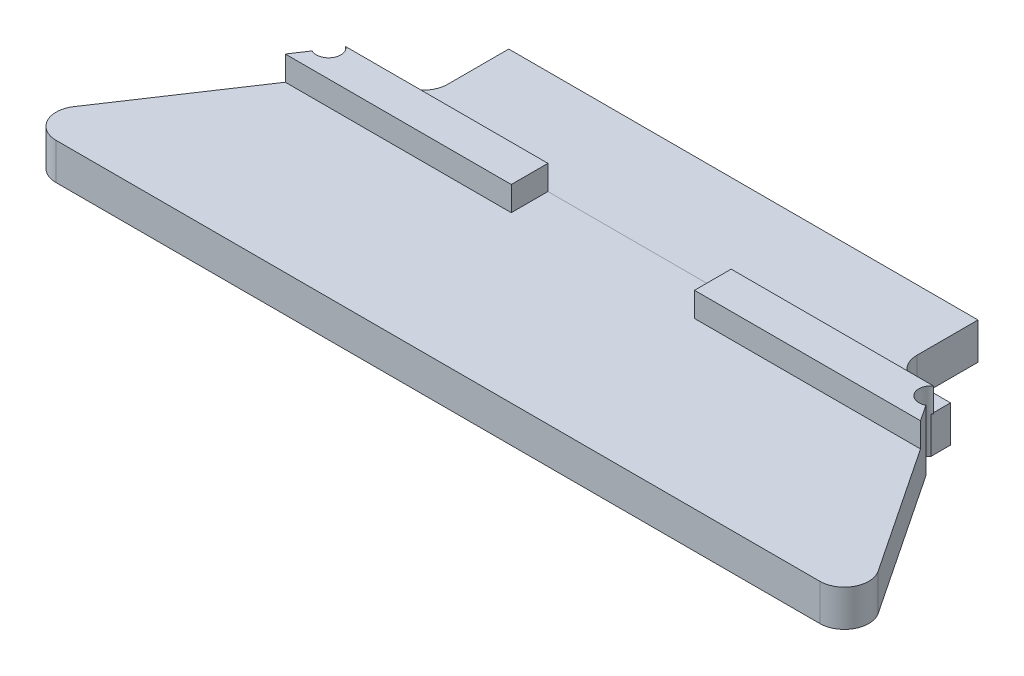
ISO-10303-21;
HEADER;
FILE_DESCRIPTION(('STEP AP214'),'2;1');
FILE_NAME('part.step','',(''),(''),'','','');
FILE_SCHEMA(('AUTOMOTIVE_DESIGN { 1 0 10303 214 1 1 1 1 }'));
ENDSEC;
DATA;
#1=APPLICATION_CONTEXT('core data for automotive mechanical design processes');
#2=APPLICATION_PROTOCOL_DEFINITION('international standard','automotive_design',2000,#1);
#3=PRODUCT_CONTEXT('',#1,'mechanical');
#4=PRODUCT('Part','Part','',(#3));
#5=PRODUCT_RELATED_PRODUCT_CATEGORY('part','',(#4));
#6=PRODUCT_DEFINITION_FORMATION('','',#4);
#7=PRODUCT_DEFINITION_CONTEXT('part definition',#1,'design');
#8=PRODUCT_DEFINITION('design','',#6,#7);
#9=PRODUCT_DEFINITION_SHAPE('','',#8);
#10=(LENGTH_UNIT() NAMED_UNIT(*) SI_UNIT(.MILLI.,.METRE.));
#11=(NAMED_UNIT(*) PLANE_ANGLE_UNIT() SI_UNIT($,.RADIAN.));
#12=(NAMED_UNIT(*) SI_UNIT($,.STERADIAN.) SOLID_ANGLE_UNIT());
#13=UNCERTAINTY_MEASURE_WITH_UNIT(LENGTH_MEASURE(1.E-05),#10,'distance_accuracy_value','');
#14=(GEOMETRIC_REPRESENTATION_CONTEXT(3) GLOBAL_UNCERTAINTY_ASSIGNED_CONTEXT((#13)) GLOBAL_UNIT_ASSIGNED_CONTEXT((#10,
#11,#12)) REPRESENTATION_CONTEXT('',''));
#15=CARTESIAN_POINT('',(0.,0.,0.));
#16=DIRECTION('',(0.,0.,1.));
#17=DIRECTION('',(1.,0.,0.));
#18=AXIS2_PLACEMENT_3D('',#15,#16,#17);
#19=CARTESIAN_POINT('',(0.,-1.5,0.));
#20=DIRECTION('',(0.,1.,0.));
#21=DIRECTION('',(0.,0.,1.));
#22=AXIS2_PLACEMENT_3D('',#19,#20,#21);
#23=PLANE('',#22);
#24=DIRECTION('',(-1.,0.,0.));
#25=VECTOR('',#24,1.);
#26=CARTESIAN_POINT('',(0.,-1.5,-4.00000000000001));
#27=LINE('',#26,#25);
#28=CARTESIAN_POINT('',(23.95625,-1.5,-4.00000000000001));
#29=VERTEX_POINT('',#28);
#30=CARTESIAN_POINT('',(7.50000000000001,-1.5,-4.00000000000001));
#31=VERTEX_POINT('',#30);
#32=EDGE_CURVE('E11',#29,#31,#27,.T.);
#33=ORIENTED_EDGE('',*,*,#32,.F.);
#34=DIRECTION('',(0.,0.,1.));
#35=VECTOR('',#34,1.);
#36=CARTESIAN_POINT('',(23.95625,-1.5,-5.50000000000001));
#37=LINE('',#36,#35);
#38=CARTESIAN_POINT('',(23.95625,-1.5,-3.91421356237311));
#39=VERTEX_POINT('',#38);
#40=EDGE_CURVE('E299',#29,#39,#37,.T.);
#41=ORIENTED_EDGE('',*,*,#40,.T.);
#42=CARTESIAN_POINT('',(24.6633567811865,-1.5,-3.20710678118655));
#43=DIRECTION('',(0.,1.,0.));
#44=DIRECTION('',(0.,0.,-1.));
#45=AXIS2_PLACEMENT_3D('',#42,#43,#44);
#46=CIRCLE('',#45,1.);
#47=CARTESIAN_POINT('',(25.1212626139406,-1.5,-2.31810607908908));
#48=VERTEX_POINT('',#47);
#49=EDGE_CURVE('E288',#39,#48,#46,.T.);
#50=ORIENTED_EDGE('',*,*,#49,.T.);
#51=DIRECTION('',(-0.554700196225229,0.,-0.832050294337843));
#52=VECTOR('',#51,1.);
#53=CARTESIAN_POINT('',(25.,-1.5,-2.5));
#54=LINE('',#53,#52);
#55=CARTESIAN_POINT('',(32.927066405033,-1.5,9.39059960754954));
#56=VERTEX_POINT('',#55);
#57=EDGE_CURVE('E344',#56,#48,#54,.T.);
#58=ORIENTED_EDGE('',*,*,#57,.F.);
#59=CARTESIAN_POINT('',(31.2629658163574,-1.5,10.5));
#60=DIRECTION('',(0.,1.,0.));
#61=DIRECTION('',(0.,0.,1.));
#62=AXIS2_PLACEMENT_3D('',#59,#60,#61);
#63=CIRCLE('',#62,2.);
#64=CARTESIAN_POINT('',(31.2629658163574,-1.5,12.5));
#65=VERTEX_POINT('',#64);
#66=EDGE_CURVE('E381',#56,#65,#63,.F.);
#67=ORIENTED_EDGE('',*,*,#66,.T.);
#68=DIRECTION('',(1.,0.,0.));
#69=VECTOR('',#68,1.);
#70=CARTESIAN_POINT('',(35.,-1.5,12.5));
#71=LINE('',#70,#69);
#72=CARTESIAN_POINT('',(-31.2629658163573,-1.5,12.5));
#73=VERTEX_POINT('',#72);
#74=EDGE_CURVE('E318',#73,#65,#71,.T.);
#75=ORIENTED_EDGE('',*,*,#74,.F.);
#76=CARTESIAN_POINT('',(-31.2629658163573,-1.5,10.5));
#77=DIRECTION('',(0.,1.,0.));
#78=DIRECTION('',(0.,0.,1.));
#79=AXIS2_PLACEMENT_3D('',#76,#77,#78);
#80=CIRCLE('',#79,2.);
#81=CARTESIAN_POINT('',(-32.927066405033,-1.5,9.39059960754954));
#82=VERTEX_POINT('',#81);
#83=EDGE_CURVE('E379',#73,#82,#80,.F.);
#84=ORIENTED_EDGE('',*,*,#83,.T.);
#85=DIRECTION('',(-0.554700196225229,0.,0.832050294337844));
#86=VECTOR('',#85,1.);
#87=CARTESIAN_POINT('',(-25.,-1.5,-2.49999999999999));
#88=LINE('',#87,#86);
#89=CARTESIAN_POINT('',(-25.1212626139406,-1.5,-2.31810607908908));
#90=VERTEX_POINT('',#89);
#91=EDGE_CURVE('E323',#90,#82,#88,.T.);
#92=ORIENTED_EDGE('',*,*,#91,.F.);
#93=CARTESIAN_POINT('',(-24.6633567811865,-1.5,-3.20710678118655));
#94=DIRECTION('',(0.,1.,0.));
#95=DIRECTION('',(0.,0.,1.));
#96=AXIS2_PLACEMENT_3D('',#93,#94,#95);
#97=CIRCLE('',#96,1.);
#98=CARTESIAN_POINT('',(-23.95625,-1.5,-3.91421356237311));
#99=VERTEX_POINT('',#98);
#100=EDGE_CURVE('E289',#90,#99,#97,.T.);
#101=ORIENTED_EDGE('',*,*,#100,.T.);
#102=DIRECTION('',(0.,0.,-1.));
#103=VECTOR('',#102,1.);
#104=CARTESIAN_POINT('',(-23.95625,-1.5,-5.50000000000001));
#105=LINE('',#104,#103);
#106=CARTESIAN_POINT('',(-23.95625,-1.5,-4.00000000000001));
#107=VERTEX_POINT('',#106);
#108=EDGE_CURVE('E300',#99,#107,#105,.T.);
#109=ORIENTED_EDGE('',*,*,#108,.T.);
#110=DIRECTION('',(-1.,0.,0.));
#111=VECTOR('',#110,1.);
#112=CARTESIAN_POINT('',(0.,-1.5,-4.00000000000001));
#113=LINE('',#112,#111);
#114=CARTESIAN_POINT('',(-7.49999999999999,-1.5,-4.00000000000001));
#115=VERTEX_POINT('',#114);
#116=EDGE_CURVE('E411',#115,#107,#113,.T.);
#117=ORIENTED_EDGE('',*,*,#116,.F.);
#118=DIRECTION('',(-1.,0.,0.));
#119=VECTOR('',#118,1.);
#120=CARTESIAN_POINT('',(0.,-1.5,-4.00000000000001));
#121=LINE('',#120,#119);
#122=EDGE_CURVE('E51',#31,#115,#121,.T.);
#123=ORIENTED_EDGE('',*,*,#122,.F.);
#124=EDGE_LOOP('',(#33,#41,#50,#58,#67,#75,#84,#92,#101,#109,#117,#123));
#125=FACE_BOUND('',#124,.T.);
#126=ADVANCED_FACE('F42',(#125),#23,.F.);
#127=CARTESIAN_POINT('',(0.,1.5,0.));
#128=DIRECTION('',(0.,1.,0.));
#129=DIRECTION('',(0.,0.,1.));
#130=AXIS2_PLACEMENT_3D('',#127,#128,#129);
#131=PLANE('',#130);
#132=DIRECTION('',(0.,0.,1.));
#133=VECTOR('',#132,1.);
#134=CARTESIAN_POINT('',(7.50000000000001,1.5,-4.00000000000001));
#135=LINE('',#134,#133);
#136=CARTESIAN_POINT('',(7.50000000000001,1.5,-4.00000000000001));
#137=VERTEX_POINT('',#136);
#138=CARTESIAN_POINT('',(7.50000000000001,1.5,-1.00000000000001));
#139=VERTEX_POINT('',#138);
#140=EDGE_CURVE('E547',#137,#139,#135,.T.);
#141=ORIENTED_EDGE('',*,*,#140,.F.);
#142=DIRECTION('',(-1.,0.,0.));
#143=VECTOR('',#142,1.);
#144=CARTESIAN_POINT('',(0.,1.5,-4.00000000000001));
#145=LINE('',#144,#143);
#146=CARTESIAN_POINT('',(-7.49999999999999,1.5,-4.00000000000001));
#147=VERTEX_POINT('',#146);
#148=EDGE_CURVE('E408',#137,#147,#145,.T.);
#149=ORIENTED_EDGE('',*,*,#148,.T.);
#150=DIRECTION('',(0.,0.,-1.));
#151=VECTOR('',#150,1.);
#152=CARTESIAN_POINT('',(-7.49999999999999,1.5,-4.00000000000001));
#153=LINE('',#152,#151);
#154=CARTESIAN_POINT('',(-7.49999999999999,1.5,-1.00000000000001));
#155=VERTEX_POINT('',#154);
#156=EDGE_CURVE('E271',#155,#147,#153,.T.);
#157=ORIENTED_EDGE('',*,*,#156,.F.);
#158=DIRECTION('',(1.,0.,0.));
#159=VECTOR('',#158,1.);
#160=CARTESIAN_POINT('',(-7.49999999999999,1.5,-1.00000000000001));
#161=LINE('',#160,#159);
#162=CARTESIAN_POINT('',(-26.,1.5,-1.00000000000001));
#163=VERTEX_POINT('',#162);
#164=EDGE_CURVE('E268',#163,#155,#161,.T.);
#165=ORIENTED_EDGE('',*,*,#164,.F.);
#166=DIRECTION('',(-0.554700196225229,0.,0.832050294337844));
#167=VECTOR('',#166,1.);
#168=CARTESIAN_POINT('',(-25.,1.5,-2.49999999999999));
#169=LINE('',#168,#167);
#170=CARTESIAN_POINT('',(-32.927066405033,1.5,9.39059960754954));
#171=VERTEX_POINT('',#170);
#172=EDGE_CURVE('E339',#163,#171,#169,.T.);
#173=ORIENTED_EDGE('',*,*,#172,.T.);
#174=CARTESIAN_POINT('',(-31.2629658163573,1.5,10.5));
#175=DIRECTION('',(0.,1.,0.));
#176=DIRECTION('',(0.,0.,1.));
#177=AXIS2_PLACEMENT_3D('',#174,#175,#176);
#178=CIRCLE('',#177,2.);
#179=CARTESIAN_POINT('',(-31.2629658163573,1.5,12.5));
#180=VERTEX_POINT('',#179);
#181=EDGE_CURVE('E388',#171,#180,#178,.T.);
#182=ORIENTED_EDGE('',*,*,#181,.T.);
#183=DIRECTION('',(1.,0.,0.));
#184=VECTOR('',#183,1.);
#185=CARTESIAN_POINT('',(-35.,1.5,12.5));
#186=LINE('',#185,#184);
#187=CARTESIAN_POINT('',(31.2629658163574,1.5,12.5));
#188=VERTEX_POINT('',#187);
#189=EDGE_CURVE('E319',#180,#188,#186,.T.);
#190=ORIENTED_EDGE('',*,*,#189,.T.);
#191=CARTESIAN_POINT('',(31.2629658163574,1.5,10.5));
#192=DIRECTION('',(0.,1.,0.));
#193=DIRECTION('',(0.,0.,1.));
#194=AXIS2_PLACEMENT_3D('',#191,#192,#193);
#195=CIRCLE('',#194,2.);
#196=CARTESIAN_POINT('',(32.927066405033,1.5,9.39059960754954));
#197=VERTEX_POINT('',#196);
#198=EDGE_CURVE('E390',#188,#197,#195,.T.);
#199=ORIENTED_EDGE('',*,*,#198,.T.);
#200=DIRECTION('',(-0.554700196225229,0.,-0.832050294337843));
#201=VECTOR('',#200,1.);
#202=CARTESIAN_POINT('',(25.,1.5,-2.5));
#203=LINE('',#202,#201);
#204=CARTESIAN_POINT('',(26.,1.5,-1.00000000000001));
#205=VERTEX_POINT('',#204);
#206=EDGE_CURVE('E322',#197,#205,#203,.T.);
#207=ORIENTED_EDGE('',*,*,#206,.T.);
#208=DIRECTION('',(1.,0.,0.));
#209=VECTOR('',#208,1.);
#210=CARTESIAN_POINT('',(7.50000000000001,1.5,-1.00000000000001));
#211=LINE('',#210,#209);
#212=EDGE_CURVE('E238',#139,#205,#211,.T.);
#213=ORIENTED_EDGE('',*,*,#212,.F.);
#214=EDGE_LOOP('',(#141,#149,#157,#165,#173,#182,#190,#199,#207,#213));
#215=FACE_BOUND('',#214,.T.);
#216=ADVANCED_FACE('F479',(#215),#131,.T.);
#217=ORIENTED_EDGE('',*,*,#148,.F.);
#218=DIRECTION('',(-1.,0.,0.));
#219=VECTOR('',#218,1.);
#220=CARTESIAN_POINT('',(24.0539961789487,1.5,-4.00000000000001));
#221=LINE('',#220,#219);
#222=CARTESIAN_POINT('',(23.95625,1.5,-4.00000000000001));
#223=VERTEX_POINT('',#222);
#224=EDGE_CURVE('E544',#223,#137,#221,.T.);
#225=ORIENTED_EDGE('',*,*,#224,.F.);
#226=DIRECTION('',(0.,0.,1.));
#227=VECTOR('',#226,1.);
#228=CARTESIAN_POINT('',(23.95625,1.5,0.));
#229=LINE('',#228,#227);
#230=CARTESIAN_POINT('',(23.95625,1.5,-5.50000000000001));
#231=VERTEX_POINT('',#230);
#232=EDGE_CURVE('E307',#231,#223,#229,.T.);
#233=ORIENTED_EDGE('',*,*,#232,.F.);
#234=DIRECTION('',(-1.,0.,0.));
#235=VECTOR('',#234,1.);
#236=CARTESIAN_POINT('',(24.20625,1.5,-5.50000000000001));
#237=LINE('',#236,#235);
#238=CARTESIAN_POINT('',(21.20625,1.5,-5.50000000000001));
#239=VERTEX_POINT('',#238);
#240=EDGE_CURVE('E326',#231,#239,#237,.T.);
#241=ORIENTED_EDGE('',*,*,#240,.T.);
#242=CARTESIAN_POINT('',(21.20625,1.5,-7.50000000000001));
#243=DIRECTION('',(0.,1.,0.));
#244=DIRECTION('',(0.,0.,1.));
#245=AXIS2_PLACEMENT_3D('',#242,#243,#244);
#246=CIRCLE('',#245,2.);
#247=CARTESIAN_POINT('',(19.20625,1.5,-7.50000000000001));
#248=VERTEX_POINT('',#247);
#249=EDGE_CURVE('E402',#239,#248,#246,.F.);
#250=ORIENTED_EDGE('',*,*,#249,.T.);
#251=DIRECTION('',(0.,0.,-1.));
#252=VECTOR('',#251,1.);
#253=CARTESIAN_POINT('',(19.20625,1.5,-5.50000000000001));
#254=LINE('',#253,#252);
#255=CARTESIAN_POINT('',(19.20625,1.5,-12.5));
#256=VERTEX_POINT('',#255);
#257=EDGE_CURVE('E329',#248,#256,#254,.T.);
#258=ORIENTED_EDGE('',*,*,#257,.T.);
#259=DIRECTION('',(-1.,0.,0.));
#260=VECTOR('',#259,1.);
#261=CARTESIAN_POINT('',(-19.20625,1.5,-12.5));
#262=LINE('',#261,#260);
#263=CARTESIAN_POINT('',(-19.20625,1.5,-12.5));
#264=VERTEX_POINT('',#263);
#265=EDGE_CURVE('E331',#256,#264,#262,.T.);
#266=ORIENTED_EDGE('',*,*,#265,.T.);
#267=DIRECTION('',(0.,0.,1.));
#268=VECTOR('',#267,1.);
#269=CARTESIAN_POINT('',(-19.20625,1.5,-5.50000000000001));
#270=LINE('',#269,#268);
#271=CARTESIAN_POINT('',(-19.20625,1.5,-7.50000000000001));
#272=VERTEX_POINT('',#271);
#273=EDGE_CURVE('E333',#264,#272,#270,.T.);
#274=ORIENTED_EDGE('',*,*,#273,.T.);
#275=CARTESIAN_POINT('',(-21.20625,1.5,-7.50000000000001));
#276=DIRECTION('',(0.,1.,0.));
#277=DIRECTION('',(0.,0.,1.));
#278=AXIS2_PLACEMENT_3D('',#275,#276,#277);
#279=CIRCLE('',#278,2.);
#280=CARTESIAN_POINT('',(-21.20625,1.5,-5.50000000000001));
#281=VERTEX_POINT('',#280);
#282=EDGE_CURVE('E406',#272,#281,#279,.F.);
#283=ORIENTED_EDGE('',*,*,#282,.T.);
#284=DIRECTION('',(-1.,0.,0.));
#285=VECTOR('',#284,1.);
#286=CARTESIAN_POINT('',(-24.20625,1.5,-5.50000000000001));
#287=LINE('',#286,#285);
#288=CARTESIAN_POINT('',(-23.95625,1.5,-5.50000000000001));
#289=VERTEX_POINT('',#288);
#290=EDGE_CURVE('E336',#281,#289,#287,.T.);
#291=ORIENTED_EDGE('',*,*,#290,.T.);
#292=DIRECTION('',(0.,0.,-1.));
#293=VECTOR('',#292,1.);
#294=CARTESIAN_POINT('',(-23.95625,1.5,0.));
#295=LINE('',#294,#293);
#296=CARTESIAN_POINT('',(-23.95625,1.5,-4.00000000000001));
#297=VERTEX_POINT('',#296);
#298=EDGE_CURVE('E314',#297,#289,#295,.T.);
#299=ORIENTED_EDGE('',*,*,#298,.F.);
#300=DIRECTION('',(-1.,0.,0.));
#301=VECTOR('',#300,1.);
#302=CARTESIAN_POINT('',(-24.0539961789487,1.5,-4.00000000000001));
#303=LINE('',#302,#301);
#304=EDGE_CURVE('E257',#147,#297,#303,.T.);
#305=ORIENTED_EDGE('',*,*,#304,.F.);
#306=EDGE_LOOP('',(#217,#225,#233,#241,#250,#258,#266,#274,#283,#291,#299,#305));
#307=FACE_BOUND('',#306,.T.);
#308=ADVANCED_FACE('F454',(#307),#131,.T.);
#309=CARTESIAN_POINT('',(35.,1.5,12.5));
#310=DIRECTION('',(0.,0.,-1.));
#311=DIRECTION('',(-1.,0.,0.));
#312=AXIS2_PLACEMENT_3D('',#309,#310,#311);
#313=PLANE('',#312);
#314=ORIENTED_EDGE('',*,*,#74,.T.);
#315=DIRECTION('',(0.,-1.,0.));
#316=VECTOR('',#315,1.);
#317=CARTESIAN_POINT('',(31.2629658163574,1.5,12.5));
#318=LINE('',#317,#316);
#319=EDGE_CURVE('E386',#65,#188,#318,.F.);
#320=ORIENTED_EDGE('',*,*,#319,.T.);
#321=ORIENTED_EDGE('',*,*,#189,.F.);
#322=DIRECTION('',(0.,-1.,0.));
#323=VECTOR('',#322,1.);
#324=CARTESIAN_POINT('',(-31.2629658163573,1.5,12.5));
#325=LINE('',#324,#323);
#326=EDGE_CURVE('E383',#180,#73,#325,.T.);
#327=ORIENTED_EDGE('',*,*,#326,.T.);
#328=EDGE_LOOP('',(#314,#320,#321,#327));
#329=FACE_BOUND('',#328,.T.);
#330=ADVANCED_FACE('F518',(#329),#313,.F.);
#331=CARTESIAN_POINT('',(25.,1.5,-2.5));
#332=DIRECTION('',(-0.832050294337844,0.,0.554700196225229));
#333=DIRECTION('',(0.554700196225229,0.,0.832050294337844));
#334=AXIS2_PLACEMENT_3D('',#331,#332,#333);
#335=PLANE('',#334);
#336=ORIENTED_EDGE('',*,*,#206,.F.);
#337=DIRECTION('',(0.,-1.,0.));
#338=VECTOR('',#337,1.);
#339=CARTESIAN_POINT('',(32.927066405033,1.5,9.39059960754954));
#340=LINE('',#339,#338);
#341=EDGE_CURVE('E376',#197,#56,#340,.T.);
#342=ORIENTED_EDGE('',*,*,#341,.T.);
#343=ORIENTED_EDGE('',*,*,#57,.T.);
#344=DIRECTION('',(0.,1.,0.));
#345=VECTOR('',#344,1.);
#346=CARTESIAN_POINT('',(25.1212626139406,-1.5,-2.31810607908908));
#347=LINE('',#346,#345);
#348=CARTESIAN_POINT('',(25.1212626139406,3.5,-2.31810607908908));
#349=VERTEX_POINT('',#348);
#350=EDGE_CURVE('E297',#48,#349,#347,.T.);
#351=ORIENTED_EDGE('',*,*,#350,.T.);
#352=DIRECTION('',(-0.554700196225229,0.,-0.832050294337844));
#353=VECTOR('',#352,1.);
#354=CARTESIAN_POINT('',(26.,3.5,-1.00000000000001));
#355=LINE('',#354,#353);
#356=CARTESIAN_POINT('',(26.,3.5,-1.00000000000001));
#357=VERTEX_POINT('',#356);
#358=EDGE_CURVE('E235',#357,#349,#355,.T.);
#359=ORIENTED_EDGE('',*,*,#358,.F.);
#360=DIRECTION('',(0.,-1.,0.));
#361=VECTOR('',#360,1.);
#362=CARTESIAN_POINT('',(26.,3.5,-1.00000000000001));
#363=LINE('',#362,#361);
#364=EDGE_CURVE('E553',#357,#205,#363,.T.);
#365=ORIENTED_EDGE('',*,*,#364,.T.);
#366=EDGE_LOOP('',(#336,#342,#343,#351,#359,#365));
#367=FACE_BOUND('',#366,.T.);
#368=ADVANCED_FACE('F515',(#367),#335,.F.);
#369=CARTESIAN_POINT('',(24.20625,1.5,-5.50000000000001));
#370=DIRECTION('',(0.,0.,1.));
#371=DIRECTION('',(1.,0.,0.));
#372=AXIS2_PLACEMENT_3D('',#369,#370,#371);
#373=PLANE('',#372);
#374=DIRECTION('',(-1.,0.,0.));
#375=VECTOR('',#374,1.);
#376=CARTESIAN_POINT('',(24.20625,-1.5,-5.50000000000001));
#377=LINE('',#376,#375);
#378=CARTESIAN_POINT('',(23.95625,-1.5,-5.50000000000001));
#379=VERTEX_POINT('',#378);
#380=CARTESIAN_POINT('',(21.20625,-1.5,-5.50000000000001));
#381=VERTEX_POINT('',#380);
#382=EDGE_CURVE('E346',#379,#381,#377,.T.);
#383=ORIENTED_EDGE('',*,*,#382,.T.);
#384=DIRECTION('',(0.,-1.,0.));
#385=VECTOR('',#384,1.);
#386=CARTESIAN_POINT('',(21.20625,1.5,-5.50000000000001));
#387=LINE('',#386,#385);
#388=EDGE_CURVE('E374',#381,#239,#387,.F.);
#389=ORIENTED_EDGE('',*,*,#388,.T.);
#390=ORIENTED_EDGE('',*,*,#240,.F.);
#391=DIRECTION('',(0.,1.,0.));
#392=VECTOR('',#391,1.);
#393=CARTESIAN_POINT('',(23.95625,-1.5,-5.50000000000001));
#394=LINE('',#393,#392);
#395=EDGE_CURVE('E310',#379,#231,#394,.T.);
#396=ORIENTED_EDGE('',*,*,#395,.F.);
#397=EDGE_LOOP('',(#383,#389,#390,#396));
#398=FACE_BOUND('',#397,.T.);
#399=ADVANCED_FACE('F511',(#398),#373,.F.);
#400=CARTESIAN_POINT('',(19.20625,1.5,-5.50000000000001));
#401=DIRECTION('',(-1.,0.,0.));
#402=DIRECTION('',(0.,0.,1.));
#403=AXIS2_PLACEMENT_3D('',#400,#401,#402);
#404=PLANE('',#403);
#405=ORIENTED_EDGE('',*,*,#257,.F.);
#406=DIRECTION('',(0.,-1.,0.));
#407=VECTOR('',#406,1.);
#408=CARTESIAN_POINT('',(19.20625,-1.5,-7.50000000000001));
#409=LINE('',#408,#407);
#410=CARTESIAN_POINT('',(19.20625,-1.5,-7.50000000000001));
#411=VERTEX_POINT('',#410);
#412=EDGE_CURVE('E371',#248,#411,#409,.T.);
#413=ORIENTED_EDGE('',*,*,#412,.T.);
#414=DIRECTION('',(0.,0.,-1.));
#415=VECTOR('',#414,1.);
#416=CARTESIAN_POINT('',(19.20625,-1.5,-5.50000000000001));
#417=LINE('',#416,#415);
#418=CARTESIAN_POINT('',(19.20625,-1.5,-12.5));
#419=VERTEX_POINT('',#418);
#420=EDGE_CURVE('E349',#411,#419,#417,.T.);
#421=ORIENTED_EDGE('',*,*,#420,.T.);
#422=DIRECTION('',(0.,-1.,0.));
#423=VECTOR('',#422,1.);
#424=CARTESIAN_POINT('',(19.20625,1.5,-12.5));
#425=LINE('',#424,#423);
#426=EDGE_CURVE('E363',#256,#419,#425,.T.);
#427=ORIENTED_EDGE('',*,*,#426,.F.);
#428=EDGE_LOOP('',(#405,#413,#421,#427));
#429=FACE_BOUND('',#428,.T.);
#430=ADVANCED_FACE('F507',(#429),#404,.F.);
#431=CARTESIAN_POINT('',(-19.20625,1.5,-12.5));
#432=DIRECTION('',(0.,0.,1.));
#433=DIRECTION('',(1.,0.,0.));
#434=AXIS2_PLACEMENT_3D('',#431,#432,#433);
#435=PLANE('',#434);
#436=DIRECTION('',(-1.,0.,0.));
#437=VECTOR('',#436,1.);
#438=CARTESIAN_POINT('',(-19.20625,-1.5,-12.5));
#439=LINE('',#438,#437);
#440=CARTESIAN_POINT('',(-19.20625,-1.5,-12.5));
#441=VERTEX_POINT('',#440);
#442=EDGE_CURVE('E351',#419,#441,#439,.T.);
#443=ORIENTED_EDGE('',*,*,#442,.T.);
#444=DIRECTION('',(0.,-1.,0.));
#445=VECTOR('',#444,1.);
#446=CARTESIAN_POINT('',(-19.20625,1.5,-12.5));
#447=LINE('',#446,#445);
#448=EDGE_CURVE('E341',#264,#441,#447,.T.);
#449=ORIENTED_EDGE('',*,*,#448,.F.);
#450=ORIENTED_EDGE('',*,*,#265,.F.);
#451=ORIENTED_EDGE('',*,*,#426,.T.);
#452=EDGE_LOOP('',(#443,#449,#450,#451));
#453=FACE_BOUND('',#452,.T.);
#454=ADVANCED_FACE('F504',(#453),#435,.F.);
#455=CARTESIAN_POINT('',(-19.20625,1.5,-5.50000000000001));
#456=DIRECTION('',(1.,0.,0.));
#457=DIRECTION('',(0.,0.,-1.));
#458=AXIS2_PLACEMENT_3D('',#455,#456,#457);
#459=PLANE('',#458);
#460=DIRECTION('',(0.,0.,1.));
#461=VECTOR('',#460,1.);
#462=CARTESIAN_POINT('',(-19.20625,-1.5,-5.50000000000001));
#463=LINE('',#462,#461);
#464=CARTESIAN_POINT('',(-19.20625,-1.5,-7.50000000000001));
#465=VERTEX_POINT('',#464);
#466=EDGE_CURVE('E353',#441,#465,#463,.T.);
#467=ORIENTED_EDGE('',*,*,#466,.T.);
#468=DIRECTION('',(0.,-1.,0.));
#469=VECTOR('',#468,1.);
#470=CARTESIAN_POINT('',(-19.20625,1.5,-7.50000000000001));
#471=LINE('',#470,#469);
#472=EDGE_CURVE('E395',#465,#272,#471,.F.);
#473=ORIENTED_EDGE('',*,*,#472,.T.);
#474=ORIENTED_EDGE('',*,*,#273,.F.);
#475=ORIENTED_EDGE('',*,*,#448,.T.);
#476=EDGE_LOOP('',(#467,#473,#474,#475));
#477=FACE_BOUND('',#476,.T.);
#478=ADVANCED_FACE('F464',(#477),#459,.F.);
#479=CARTESIAN_POINT('',(-24.20625,1.5,-5.50000000000001));
#480=DIRECTION('',(0.,0.,1.));
#481=DIRECTION('',(1.,0.,0.));
#482=AXIS2_PLACEMENT_3D('',#479,#480,#481);
#483=PLANE('',#482);
#484=ORIENTED_EDGE('',*,*,#290,.F.);
#485=DIRECTION('',(0.,-1.,0.));
#486=VECTOR('',#485,1.);
#487=CARTESIAN_POINT('',(-21.20625,-1.5,-5.50000000000001));
#488=LINE('',#487,#486);
#489=CARTESIAN_POINT('',(-21.20625,-1.5,-5.50000000000001));
#490=VERTEX_POINT('',#489);
#491=EDGE_CURVE('E392',#281,#490,#488,.T.);
#492=ORIENTED_EDGE('',*,*,#491,.T.);
#493=DIRECTION('',(-1.,0.,0.));
#494=VECTOR('',#493,1.);
#495=CARTESIAN_POINT('',(-24.20625,-1.5,-5.50000000000001));
#496=LINE('',#495,#494);
#497=CARTESIAN_POINT('',(-23.95625,-1.5,-5.50000000000001));
#498=VERTEX_POINT('',#497);
#499=EDGE_CURVE('E356',#490,#498,#496,.T.);
#500=ORIENTED_EDGE('',*,*,#499,.T.);
#501=DIRECTION('',(0.,1.,0.));
#502=VECTOR('',#501,1.);
#503=CARTESIAN_POINT('',(-23.95625,-1.5,-5.50000000000001));
#504=LINE('',#503,#502);
#505=EDGE_CURVE('E303',#498,#289,#504,.T.);
#506=ORIENTED_EDGE('',*,*,#505,.T.);
#507=EDGE_LOOP('',(#484,#492,#500,#506));
#508=FACE_BOUND('',#507,.T.);
#509=ADVANCED_FACE('F458',(#508),#483,.F.);
#510=CARTESIAN_POINT('',(-25.,1.5,-2.49999999999999));
#511=DIRECTION('',(0.832050294337844,0.,0.554700196225229));
#512=DIRECTION('',(0.554700196225229,0.,-0.832050294337844));
#513=AXIS2_PLACEMENT_3D('',#510,#511,#512);
#514=PLANE('',#513);
#515=ORIENTED_EDGE('',*,*,#91,.T.);
#516=DIRECTION('',(0.,-1.,0.));
#517=VECTOR('',#516,1.);
#518=CARTESIAN_POINT('',(-32.927066405033,1.5,9.39059960754954));
#519=LINE('',#518,#517);
#520=EDGE_CURVE('E397',#82,#171,#519,.F.);
#521=ORIENTED_EDGE('',*,*,#520,.T.);
#522=ORIENTED_EDGE('',*,*,#172,.F.);
#523=DIRECTION('',(0.,-1.,0.));
#524=VECTOR('',#523,1.);
#525=CARTESIAN_POINT('',(-26.,3.5,-1.00000000000001));
#526=LINE('',#525,#524);
#527=CARTESIAN_POINT('',(-26.,3.5,-1.00000000000001));
#528=VERTEX_POINT('',#527);
#529=EDGE_CURVE('E285',#528,#163,#526,.T.);
#530=ORIENTED_EDGE('',*,*,#529,.F.);
#531=DIRECTION('',(-0.554700196225229,0.,0.832050294337843));
#532=VECTOR('',#531,1.);
#533=CARTESIAN_POINT('',(-25.1212626139406,3.5,-2.31810607908908));
#534=LINE('',#533,#532);
#535=CARTESIAN_POINT('',(-25.1212626139406,3.5,-2.31810607908908));
#536=VERTEX_POINT('',#535);
#537=EDGE_CURVE('E256',#536,#528,#534,.T.);
#538=ORIENTED_EDGE('',*,*,#537,.F.);
#539=DIRECTION('',(0.,1.,0.));
#540=VECTOR('',#539,1.);
#541=CARTESIAN_POINT('',(-25.1212626139406,-1.5,-2.31810607908908));
#542=LINE('',#541,#540);
#543=EDGE_CURVE('E292',#536,#90,#542,.F.);
#544=ORIENTED_EDGE('',*,*,#543,.T.);
#545=EDGE_LOOP('',(#515,#521,#522,#530,#538,#544));
#546=FACE_BOUND('',#545,.T.);
#547=ADVANCED_FACE('F436',(#546),#514,.F.);
#548=EDGE_CURVE('E308',#379,#29,#37,.T.);
#549=ORIENTED_EDGE('',*,*,#548,.T.);
#550=ORIENTED_EDGE('',*,*,#32,.T.);
#551=ORIENTED_EDGE('',*,*,#122,.T.);
#552=ORIENTED_EDGE('',*,*,#116,.T.);
#553=EDGE_CURVE('E304',#107,#498,#105,.T.);
#554=ORIENTED_EDGE('',*,*,#553,.T.);
#555=ORIENTED_EDGE('',*,*,#499,.F.);
#556=CARTESIAN_POINT('',(-21.20625,-1.5,-7.50000000000001));
#557=DIRECTION('',(0.,1.,0.));
#558=DIRECTION('',(0.,0.,1.));
#559=AXIS2_PLACEMENT_3D('',#556,#557,#558);
#560=CIRCLE('',#559,2.);
#561=EDGE_CURVE('E404',#490,#465,#560,.T.);
#562=ORIENTED_EDGE('',*,*,#561,.T.);
#563=ORIENTED_EDGE('',*,*,#466,.F.);
#564=ORIENTED_EDGE('',*,*,#442,.F.);
#565=ORIENTED_EDGE('',*,*,#420,.F.);
#566=CARTESIAN_POINT('',(21.20625,-1.5,-7.50000000000001));
#567=DIRECTION('',(0.,1.,0.));
#568=DIRECTION('',(0.,0.,1.));
#569=AXIS2_PLACEMENT_3D('',#566,#567,#568);
#570=CIRCLE('',#569,2.);
#571=EDGE_CURVE('E400',#411,#381,#570,.T.);
#572=ORIENTED_EDGE('',*,*,#571,.T.);
#573=ORIENTED_EDGE('',*,*,#382,.F.);
#574=EDGE_LOOP('',(#549,#550,#551,#552,#554,#555,#562,#563,#564,#565,#572,#573));
#575=FACE_BOUND('',#574,.T.);
#576=ADVANCED_FACE('F423',(#575),#23,.F.);
#577=CARTESIAN_POINT('',(23.95625,-1.5,-5.50000000000001));
#578=DIRECTION('',(-1.,0.,0.));
#579=DIRECTION('',(0.,0.,1.));
#580=AXIS2_PLACEMENT_3D('',#577,#578,#579);
#581=PLANE('',#580);
#582=ORIENTED_EDGE('',*,*,#232,.T.);
#583=DIRECTION('',(0.,0.,-1.));
#584=VECTOR('',#583,1.);
#585=CARTESIAN_POINT('',(23.95625,1.5,-5.50000000000001));
#586=LINE('',#585,#584);
#587=CARTESIAN_POINT('',(23.95625,1.5,-3.91421356237311));
#588=VERTEX_POINT('',#587);
#589=EDGE_CURVE('E245',#588,#223,#586,.T.);
#590=ORIENTED_EDGE('',*,*,#589,.F.);
#591=DIRECTION('',(0.,1.,0.));
#592=VECTOR('',#591,1.);
#593=CARTESIAN_POINT('',(23.95625,-1.5,-3.91421356237311));
#594=LINE('',#593,#592);
#595=EDGE_CURVE('E368',#588,#39,#594,.F.);
#596=ORIENTED_EDGE('',*,*,#595,.T.);
#597=ORIENTED_EDGE('',*,*,#40,.F.);
#598=ORIENTED_EDGE('',*,*,#548,.F.);
#599=ORIENTED_EDGE('',*,*,#395,.T.);
#600=EDGE_LOOP('',(#582,#590,#596,#597,#598,#599));
#601=FACE_BOUND('',#600,.T.);
#602=ADVANCED_FACE('F488',(#601),#581,.F.);
#603=CARTESIAN_POINT('',(-23.95625,-1.5,-5.50000000000001));
#604=DIRECTION('',(1.,0.,0.));
#605=DIRECTION('',(0.,0.,-1.));
#606=AXIS2_PLACEMENT_3D('',#603,#604,#605);
#607=PLANE('',#606);
#608=ORIENTED_EDGE('',*,*,#108,.F.);
#609=DIRECTION('',(0.,1.,0.));
#610=VECTOR('',#609,1.);
#611=CARTESIAN_POINT('',(-23.95625,-1.5,-3.91421356237311));
#612=LINE('',#611,#610);
#613=CARTESIAN_POINT('',(-23.95625,1.5,-3.91421356237311));
#614=VERTEX_POINT('',#613);
#615=EDGE_CURVE('E366',#99,#614,#612,.T.);
#616=ORIENTED_EDGE('',*,*,#615,.T.);
#617=EDGE_CURVE('E315',#614,#297,#295,.T.);
#618=ORIENTED_EDGE('',*,*,#617,.T.);
#619=ORIENTED_EDGE('',*,*,#298,.T.);
#620=ORIENTED_EDGE('',*,*,#505,.F.);
#621=ORIENTED_EDGE('',*,*,#553,.F.);
#622=EDGE_LOOP('',(#608,#616,#618,#619,#620,#621));
#623=FACE_BOUND('',#622,.T.);
#624=ADVANCED_FACE('F429',(#623),#607,.F.);
#625=CARTESIAN_POINT('',(-24.6633567811865,-1.5,-3.20710678118655));
#626=DIRECTION('',(0.,1.,0.));
#627=DIRECTION('',(0.,0.,1.));
#628=AXIS2_PLACEMENT_3D('',#625,#626,#627);
#629=CYLINDRICAL_SURFACE('',#628,1.);
#630=ORIENTED_EDGE('',*,*,#100,.F.);
#631=ORIENTED_EDGE('',*,*,#543,.F.);
#632=CARTESIAN_POINT('',(-24.6633567811865,3.5,-3.20710678118655));
#633=DIRECTION('',(0.,-1.,0.));
#634=DIRECTION('',(0.,0.,-1.));
#635=AXIS2_PLACEMENT_3D('',#632,#633,#634);
#636=CIRCLE('',#635,1.);
#637=CARTESIAN_POINT('',(-24.0539961789487,3.5,-4.00000000000001));
#638=VERTEX_POINT('',#637);
#639=EDGE_CURVE('E253',#638,#536,#636,.T.);
#640=ORIENTED_EDGE('',*,*,#639,.F.);
#641=DIRECTION('',(0.,-1.,0.));
#642=VECTOR('',#641,1.);
#643=CARTESIAN_POINT('',(-24.0539961789487,3.5,-4.00000000000001));
#644=LINE('',#643,#642);
#645=CARTESIAN_POINT('',(-24.0539961789487,1.5,-4.00000000000001));
#646=VERTEX_POINT('',#645);
#647=EDGE_CURVE('E265',#638,#646,#644,.T.);
#648=ORIENTED_EDGE('',*,*,#647,.T.);
#649=CARTESIAN_POINT('',(-24.6633567811865,1.5,-3.20710678118655));
#650=DIRECTION('',(0.,-1.,0.));
#651=DIRECTION('',(0.,0.,-1.));
#652=AXIS2_PLACEMENT_3D('',#649,#650,#651);
#653=CIRCLE('',#652,1.);
#654=EDGE_CURVE('E247',#646,#614,#653,.T.);
#655=ORIENTED_EDGE('',*,*,#654,.T.);
#656=ORIENTED_EDGE('',*,*,#615,.F.);
#657=EDGE_LOOP('',(#630,#631,#640,#648,#655,#656));
#658=FACE_BOUND('',#657,.T.);
#659=ADVANCED_FACE('F432',(#658),#629,.F.);
#660=CARTESIAN_POINT('',(24.6633567811865,-1.5,-3.20710678118655));
#661=DIRECTION('',(0.,1.,0.));
#662=DIRECTION('',(0.,0.,1.));
#663=AXIS2_PLACEMENT_3D('',#660,#661,#662);
#664=CYLINDRICAL_SURFACE('',#663,1.);
#665=ORIENTED_EDGE('',*,*,#49,.F.);
#666=ORIENTED_EDGE('',*,*,#595,.F.);
#667=CARTESIAN_POINT('',(24.6633567811865,1.5,-3.20710678118655));
#668=DIRECTION('',(0.,-1.,0.));
#669=DIRECTION('',(0.,0.,1.));
#670=AXIS2_PLACEMENT_3D('',#667,#668,#669);
#671=CIRCLE('',#670,1.);
#672=CARTESIAN_POINT('',(24.0539961789487,1.5,-4.00000000000001));
#673=VERTEX_POINT('',#672);
#674=EDGE_CURVE('E243',#588,#673,#671,.T.);
#675=ORIENTED_EDGE('',*,*,#674,.T.);
#676=DIRECTION('',(0.,-1.,0.));
#677=VECTOR('',#676,1.);
#678=CARTESIAN_POINT('',(24.0539961789487,3.5,-4.00000000000001));
#679=LINE('',#678,#677);
#680=CARTESIAN_POINT('',(24.0539961789487,3.5,-4.00000000000001));
#681=VERTEX_POINT('',#680);
#682=EDGE_CURVE('E222',#681,#673,#679,.T.);
#683=ORIENTED_EDGE('',*,*,#682,.F.);
#684=CARTESIAN_POINT('',(24.6633567811865,3.5,-3.20710678118655));
#685=DIRECTION('',(0.,-1.,0.));
#686=DIRECTION('',(0.,0.,1.));
#687=AXIS2_PLACEMENT_3D('',#684,#685,#686);
#688=CIRCLE('',#687,1.);
#689=EDGE_CURVE('E229',#349,#681,#688,.T.);
#690=ORIENTED_EDGE('',*,*,#689,.F.);
#691=ORIENTED_EDGE('',*,*,#350,.F.);
#692=EDGE_LOOP('',(#665,#666,#675,#683,#690,#691));
#693=FACE_BOUND('',#692,.T.);
#694=ADVANCED_FACE('F241',(#693),#664,.F.);
#695=CARTESIAN_POINT('',(21.20625,1.5,-7.50000000000001));
#696=DIRECTION('',(0.,1.,0.));
#697=DIRECTION('',(0.,0.,1.));
#698=AXIS2_PLACEMENT_3D('',#695,#696,#697);
#699=CYLINDRICAL_SURFACE('',#698,2.);
#700=ORIENTED_EDGE('',*,*,#249,.F.);
#701=ORIENTED_EDGE('',*,*,#388,.F.);
#702=ORIENTED_EDGE('',*,*,#571,.F.);
#703=ORIENTED_EDGE('',*,*,#412,.F.);
#704=EDGE_LOOP('',(#700,#701,#702,#703));
#705=FACE_BOUND('',#704,.T.);
#706=ADVANCED_FACE('F475',(#705),#699,.F.);
#707=CARTESIAN_POINT('',(31.2629658163574,1.5,10.5));
#708=DIRECTION('',(0.,-1.,0.));
#709=DIRECTION('',(0.,0.,-1.));
#710=AXIS2_PLACEMENT_3D('',#707,#708,#709);
#711=CYLINDRICAL_SURFACE('',#710,2.);
#712=ORIENTED_EDGE('',*,*,#198,.F.);
#713=ORIENTED_EDGE('',*,*,#319,.F.);
#714=ORIENTED_EDGE('',*,*,#66,.F.);
#715=ORIENTED_EDGE('',*,*,#341,.F.);
#716=EDGE_LOOP('',(#712,#713,#714,#715));
#717=FACE_BOUND('',#716,.T.);
#718=ADVANCED_FACE('F469',(#717),#711,.T.);
#719=CARTESIAN_POINT('',(-21.20625,1.5,-7.50000000000001));
#720=DIRECTION('',(0.,1.,0.));
#721=DIRECTION('',(0.,0.,1.));
#722=AXIS2_PLACEMENT_3D('',#719,#720,#721);
#723=CYLINDRICAL_SURFACE('',#722,2.);
#724=ORIENTED_EDGE('',*,*,#282,.F.);
#725=ORIENTED_EDGE('',*,*,#472,.F.);
#726=ORIENTED_EDGE('',*,*,#561,.F.);
#727=ORIENTED_EDGE('',*,*,#491,.F.);
#728=EDGE_LOOP('',(#724,#725,#726,#727));
#729=FACE_BOUND('',#728,.T.);
#730=ADVANCED_FACE('F467',(#729),#723,.F.);
#731=CARTESIAN_POINT('',(-31.2629658163573,1.5,10.5));
#732=DIRECTION('',(0.,-1.,0.));
#733=DIRECTION('',(0.,0.,-1.));
#734=AXIS2_PLACEMENT_3D('',#731,#732,#733);
#735=CYLINDRICAL_SURFACE('',#734,2.);
#736=ORIENTED_EDGE('',*,*,#181,.F.);
#737=ORIENTED_EDGE('',*,*,#520,.F.);
#738=ORIENTED_EDGE('',*,*,#83,.F.);
#739=ORIENTED_EDGE('',*,*,#326,.F.);
#740=EDGE_LOOP('',(#736,#737,#738,#739));
#741=FACE_BOUND('',#740,.T.);
#742=ADVANCED_FACE('F44',(#741),#735,.T.);
#743=CARTESIAN_POINT('',(-24.6633567811865,1.5,-3.20710678118655));
#744=DIRECTION('',(0.,-1.,0.));
#745=DIRECTION('',(0.,0.,-1.));
#746=AXIS2_PLACEMENT_3D('',#743,#744,#745);
#747=PLANE('',#746);
#748=ORIENTED_EDGE('',*,*,#617,.F.);
#749=ORIENTED_EDGE('',*,*,#654,.F.);
#750=EDGE_CURVE('E274',#297,#646,#303,.T.);
#751=ORIENTED_EDGE('',*,*,#750,.F.);
#752=EDGE_LOOP('',(#748,#749,#751));
#753=FACE_BOUND('',#752,.T.);
#754=ADVANCED_FACE('F450',(#753),#747,.T.);
#755=CARTESIAN_POINT('',(-7.49999999999999,3.5,-1.00000000000001));
#756=DIRECTION('',(0.,0.,-1.));
#757=DIRECTION('',(-1.,0.,0.));
#758=AXIS2_PLACEMENT_3D('',#755,#756,#757);
#759=PLANE('',#758);
#760=ORIENTED_EDGE('',*,*,#164,.T.);
#761=DIRECTION('',(0.,-1.,0.));
#762=VECTOR('',#761,1.);
#763=CARTESIAN_POINT('',(-7.49999999999999,3.5,-1.00000000000001));
#764=LINE('',#763,#762);
#765=CARTESIAN_POINT('',(-7.49999999999999,3.5,-1.00000000000001));
#766=VERTEX_POINT('',#765);
#767=EDGE_CURVE('E282',#766,#155,#764,.T.);
#768=ORIENTED_EDGE('',*,*,#767,.F.);
#769=DIRECTION('',(1.,0.,0.));
#770=VECTOR('',#769,1.);
#771=CARTESIAN_POINT('',(-7.49999999999999,3.5,-1.00000000000001));
#772=LINE('',#771,#770);
#773=EDGE_CURVE('E259',#528,#766,#772,.T.);
#774=ORIENTED_EDGE('',*,*,#773,.F.);
#775=ORIENTED_EDGE('',*,*,#529,.T.);
#776=EDGE_LOOP('',(#760,#768,#774,#775));
#777=FACE_BOUND('',#776,.T.);
#778=ADVANCED_FACE('F575',(#777),#759,.F.);
#779=CARTESIAN_POINT('',(-7.49999999999999,3.5,-4.00000000000001));
#780=DIRECTION('',(-1.,0.,0.));
#781=DIRECTION('',(0.,0.,1.));
#782=AXIS2_PLACEMENT_3D('',#779,#780,#781);
#783=PLANE('',#782);
#784=ORIENTED_EDGE('',*,*,#156,.T.);
#785=DIRECTION('',(0.,-1.,0.));
#786=VECTOR('',#785,1.);
#787=CARTESIAN_POINT('',(-7.49999999999999,3.5,-4.00000000000001));
#788=LINE('',#787,#786);
#789=CARTESIAN_POINT('',(-7.49999999999999,3.5,-4.00000000000001));
#790=VERTEX_POINT('',#789);
#791=EDGE_CURVE('E279',#790,#147,#788,.T.);
#792=ORIENTED_EDGE('',*,*,#791,.F.);
#793=DIRECTION('',(0.,0.,-1.));
#794=VECTOR('',#793,1.);
#795=CARTESIAN_POINT('',(-7.49999999999999,3.5,-4.00000000000001));
#796=LINE('',#795,#794);
#797=EDGE_CURVE('E261',#766,#790,#796,.T.);
#798=ORIENTED_EDGE('',*,*,#797,.F.);
#799=ORIENTED_EDGE('',*,*,#767,.T.);
#800=EDGE_LOOP('',(#784,#792,#798,#799));
#801=FACE_BOUND('',#800,.T.);
#802=ADVANCED_FACE('F580',(#801),#783,.F.);
#803=CARTESIAN_POINT('',(-24.0539961789487,3.5,-4.00000000000001));
#804=DIRECTION('',(0.,0.,1.));
#805=DIRECTION('',(1.,0.,0.));
#806=AXIS2_PLACEMENT_3D('',#803,#804,#805);
#807=PLANE('',#806);
#808=ORIENTED_EDGE('',*,*,#304,.T.);
#809=ORIENTED_EDGE('',*,*,#750,.T.);
#810=ORIENTED_EDGE('',*,*,#647,.F.);
#811=DIRECTION('',(-1.,0.,0.));
#812=VECTOR('',#811,1.);
#813=CARTESIAN_POINT('',(-24.0539961789487,3.5,-4.00000000000001));
#814=LINE('',#813,#812);
#815=EDGE_CURVE('E263',#790,#638,#814,.T.);
#816=ORIENTED_EDGE('',*,*,#815,.F.);
#817=ORIENTED_EDGE('',*,*,#791,.T.);
#818=EDGE_LOOP('',(#808,#809,#810,#816,#817));
#819=FACE_BOUND('',#818,.T.);
#820=ADVANCED_FACE('F581',(#819),#807,.F.);
#821=CARTESIAN_POINT('',(-24.6633567811865,3.5,-3.20710678118655));
#822=DIRECTION('',(0.,-1.,0.));
#823=DIRECTION('',(0.,0.,-1.));
#824=AXIS2_PLACEMENT_3D('',#821,#822,#823);
#825=PLANE('',#824);
#826=ORIENTED_EDGE('',*,*,#639,.T.);
#827=ORIENTED_EDGE('',*,*,#537,.T.);
#828=ORIENTED_EDGE('',*,*,#773,.T.);
#829=ORIENTED_EDGE('',*,*,#797,.T.);
#830=ORIENTED_EDGE('',*,*,#815,.T.);
#831=EDGE_LOOP('',(#826,#827,#828,#829,#830));
#832=FACE_BOUND('',#831,.T.);
#833=ADVANCED_FACE('F442',(#832),#825,.F.);
#834=CARTESIAN_POINT('',(24.6633567811865,1.5,-3.20710678118655));
#835=DIRECTION('',(0.,1.,0.));
#836=DIRECTION('',(0.,0.,1.));
#837=AXIS2_PLACEMENT_3D('',#834,#835,#836);
#838=PLANE('',#837);
#839=ORIENTED_EDGE('',*,*,#674,.F.);
#840=ORIENTED_EDGE('',*,*,#589,.T.);
#841=EDGE_CURVE('E545',#673,#223,#221,.T.);
#842=ORIENTED_EDGE('',*,*,#841,.F.);
#843=EDGE_LOOP('',(#839,#840,#842));
#844=FACE_BOUND('',#843,.T.);
#845=ADVANCED_FACE('F588',(#844),#838,.F.);
#846=CARTESIAN_POINT('',(24.0539961789487,3.5,-4.00000000000001));
#847=DIRECTION('',(0.,0.,1.));
#848=DIRECTION('',(1.,0.,0.));
#849=AXIS2_PLACEMENT_3D('',#846,#847,#848);
#850=PLANE('',#849);
#851=ORIENTED_EDGE('',*,*,#841,.T.);
#852=ORIENTED_EDGE('',*,*,#224,.T.);
#853=DIRECTION('',(0.,-1.,0.));
#854=VECTOR('',#853,1.);
#855=CARTESIAN_POINT('',(7.50000000000001,3.5,-4.00000000000001));
#856=LINE('',#855,#854);
#857=CARTESIAN_POINT('',(7.50000000000001,3.5,-4.00000000000001));
#858=VERTEX_POINT('',#857);
#859=EDGE_CURVE('E225',#858,#137,#856,.T.);
#860=ORIENTED_EDGE('',*,*,#859,.F.);
#861=DIRECTION('',(-1.,0.,0.));
#862=VECTOR('',#861,1.);
#863=CARTESIAN_POINT('',(24.0539961789487,3.5,-4.00000000000001));
#864=LINE('',#863,#862);
#865=EDGE_CURVE('E217',#681,#858,#864,.T.);
#866=ORIENTED_EDGE('',*,*,#865,.F.);
#867=ORIENTED_EDGE('',*,*,#682,.T.);
#868=EDGE_LOOP('',(#851,#852,#860,#866,#867));
#869=FACE_BOUND('',#868,.T.);
#870=ADVANCED_FACE('F220',(#869),#850,.F.);
#871=CARTESIAN_POINT('',(7.50000000000001,3.5,-4.00000000000001));
#872=DIRECTION('',(1.,0.,0.));
#873=DIRECTION('',(0.,0.,-1.));
#874=AXIS2_PLACEMENT_3D('',#871,#872,#873);
#875=PLANE('',#874);
#876=ORIENTED_EDGE('',*,*,#140,.T.);
#877=DIRECTION('',(0.,-1.,0.));
#878=VECTOR('',#877,1.);
#879=CARTESIAN_POINT('',(7.50000000000001,3.5,-1.00000000000001));
#880=LINE('',#879,#878);
#881=CARTESIAN_POINT('',(7.50000000000001,3.5,-1.00000000000001));
#882=VERTEX_POINT('',#881);
#883=EDGE_CURVE('E249',#882,#139,#880,.T.);
#884=ORIENTED_EDGE('',*,*,#883,.F.);
#885=DIRECTION('',(0.,0.,1.));
#886=VECTOR('',#885,1.);
#887=CARTESIAN_POINT('',(7.50000000000001,3.5,-4.00000000000001));
#888=LINE('',#887,#886);
#889=EDGE_CURVE('E228',#858,#882,#888,.T.);
#890=ORIENTED_EDGE('',*,*,#889,.F.);
#891=ORIENTED_EDGE('',*,*,#859,.T.);
#892=EDGE_LOOP('',(#876,#884,#890,#891));
#893=FACE_BOUND('',#892,.T.);
#894=ADVANCED_FACE('F731',(#893),#875,.F.);
#895=CARTESIAN_POINT('',(7.50000000000001,3.5,-1.00000000000001));
#896=DIRECTION('',(0.,0.,-1.));
#897=DIRECTION('',(-1.,0.,0.));
#898=AXIS2_PLACEMENT_3D('',#895,#896,#897);
#899=PLANE('',#898);
#900=ORIENTED_EDGE('',*,*,#212,.T.);
#901=ORIENTED_EDGE('',*,*,#364,.F.);
#902=DIRECTION('',(1.,0.,0.));
#903=VECTOR('',#902,1.);
#904=CARTESIAN_POINT('',(7.50000000000001,3.5,-1.00000000000001));
#905=LINE('',#904,#903);
#906=EDGE_CURVE('E562',#882,#357,#905,.T.);
#907=ORIENTED_EDGE('',*,*,#906,.F.);
#908=ORIENTED_EDGE('',*,*,#883,.T.);
#909=EDGE_LOOP('',(#900,#901,#907,#908));
#910=FACE_BOUND('',#909,.T.);
#911=ADVANCED_FACE('F560',(#910),#899,.F.);
#912=CARTESIAN_POINT('',(24.6633567811865,3.5,-3.20710678118655));
#913=DIRECTION('',(0.,1.,0.));
#914=DIRECTION('',(0.,0.,1.));
#915=AXIS2_PLACEMENT_3D('',#912,#913,#914);
#916=PLANE('',#915);
#917=ORIENTED_EDGE('',*,*,#689,.T.);
#918=ORIENTED_EDGE('',*,*,#865,.T.);
#919=ORIENTED_EDGE('',*,*,#889,.T.);
#920=ORIENTED_EDGE('',*,*,#906,.T.);
#921=ORIENTED_EDGE('',*,*,#358,.T.);
#922=EDGE_LOOP('',(#917,#918,#919,#920,#921));
#923=FACE_BOUND('',#922,.T.);
#924=ADVANCED_FACE('F233',(#923),#916,.T.);
#925=CLOSED_SHELL('',(#126,#216,#308,#330,#368,#399,#430,#454,#478,#509,#547,#576,#602,#624,
#659,#694,#706,#718,#730,#742,#754,#778,#802,#820,#833,#845,#870,#894,#911,#924));
#926=MANIFOLD_SOLID_BREP('B2',#925);
#927=ADVANCED_BREP_SHAPE_REPRESENTATION('',(#18,#926),#14);
#928=SHAPE_DEFINITION_REPRESENTATION(#9,#927);
ENDSEC;
END-ISO-10303-21;
